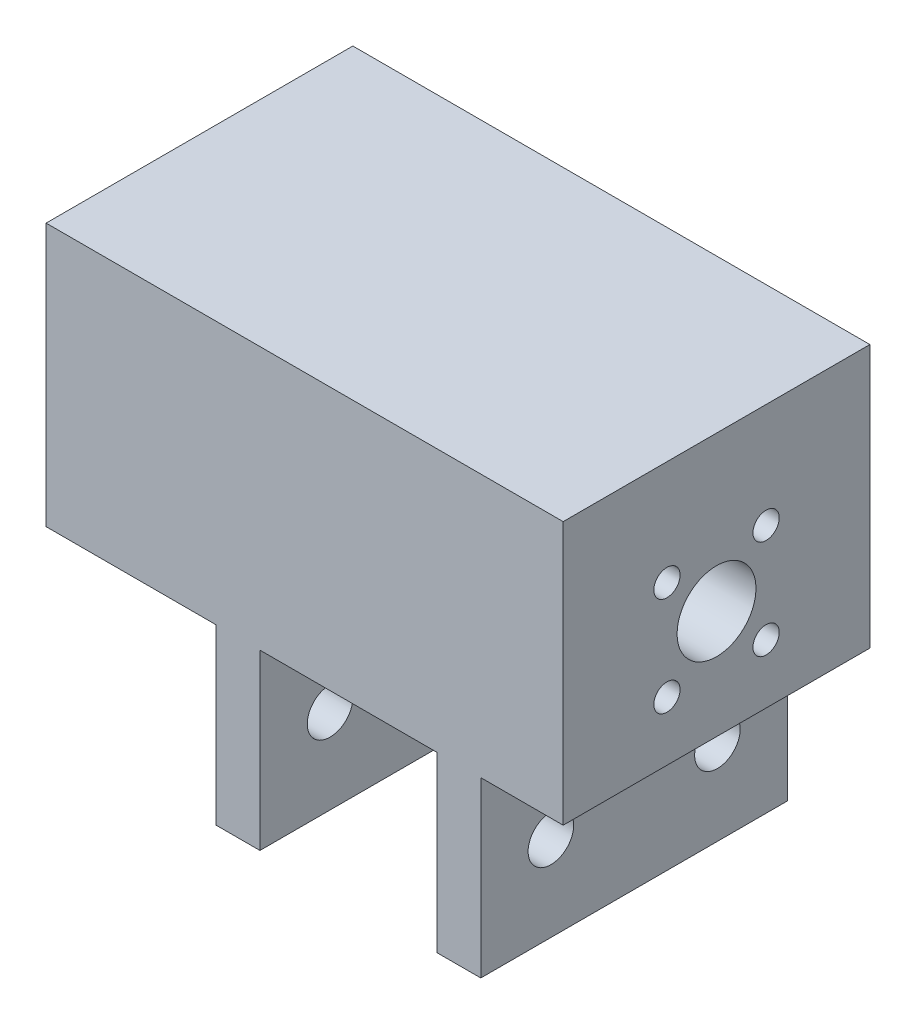
ISO-10303-21;
HEADER;
FILE_DESCRIPTION(('STEP AP214'),'2;1');
FILE_NAME('part.step','',(''),(''),'','','');
FILE_SCHEMA(('AUTOMOTIVE_DESIGN { 1 0 10303 214 1 1 1 1 }'));
ENDSEC;
DATA;
#1=APPLICATION_CONTEXT('core data for automotive mechanical design processes');
#2=APPLICATION_PROTOCOL_DEFINITION('international standard','automotive_design',2000,#1);
#3=PRODUCT_CONTEXT('',#1,'mechanical');
#4=PRODUCT('Part','Part','',(#3));
#5=PRODUCT_RELATED_PRODUCT_CATEGORY('part','',(#4));
#6=PRODUCT_DEFINITION_FORMATION('','',#4);
#7=PRODUCT_DEFINITION_CONTEXT('part definition',#1,'design');
#8=PRODUCT_DEFINITION('design','',#6,#7);
#9=PRODUCT_DEFINITION_SHAPE('','',#8);
#10=(LENGTH_UNIT() NAMED_UNIT(*) SI_UNIT(.MILLI.,.METRE.));
#11=(NAMED_UNIT(*) PLANE_ANGLE_UNIT() SI_UNIT($,.RADIAN.));
#12=(NAMED_UNIT(*) SI_UNIT($,.STERADIAN.) SOLID_ANGLE_UNIT());
#13=UNCERTAINTY_MEASURE_WITH_UNIT(LENGTH_MEASURE(1.E-05),#10,'distance_accuracy_value','');
#14=(GEOMETRIC_REPRESENTATION_CONTEXT(3) GLOBAL_UNCERTAINTY_ASSIGNED_CONTEXT((#13)) GLOBAL_UNIT_ASSIGNED_CONTEXT((#10,
#11,#12)) REPRESENTATION_CONTEXT('',''));
#15=CARTESIAN_POINT('',(0.,0.,0.));
#16=DIRECTION('',(0.,0.,1.));
#17=DIRECTION('',(1.,0.,0.));
#18=AXIS2_PLACEMENT_3D('',#15,#16,#17);
#19=CARTESIAN_POINT('',(24.5,3.05685424949239,11.8431457505076));
#20=DIRECTION('',(-1.,0.,0.));
#21=DIRECTION('',(0.,0.,1.));
#22=AXIS2_PLACEMENT_3D('',#19,#20,#21);
#23=CYLINDRICAL_SURFACE('',#22,1.5);
#24=CARTESIAN_POINT('',(24.5,3.05685424949239,11.8431457505076));
#25=DIRECTION('',(-1.,0.,0.));
#26=DIRECTION('',(0.,0.,1.));
#27=AXIS2_PLACEMENT_3D('',#24,#25,#26);
#28=CIRCLE('',#27,1.5);
#29=CARTESIAN_POINT('',(24.5,3.05685424949239,13.3431457505076));
#30=VERTEX_POINT('',#29);
#31=EDGE_CURVE('E243',#30,#30,#28,.T.);
#32=ORIENTED_EDGE('',*,*,#31,.F.);
#33=EDGE_LOOP('',(#32));
#34=FACE_BOUND('',#33,.T.);
#35=CARTESIAN_POINT('',(-20.5,3.05685424949239,11.8431457505076));
#36=DIRECTION('',(-1.,0.,0.));
#37=DIRECTION('',(0.,0.,1.));
#38=AXIS2_PLACEMENT_3D('',#35,#36,#37);
#39=CIRCLE('',#38,1.5);
#40=CARTESIAN_POINT('',(-20.5,3.05685424949239,13.3431457505076));
#41=VERTEX_POINT('',#40);
#42=EDGE_CURVE('E235',#41,#41,#39,.F.);
#43=ORIENTED_EDGE('',*,*,#42,.F.);
#44=EDGE_LOOP('',(#43));
#45=FACE_BOUND('',#44,.T.);
#46=ADVANCED_FACE('F41',(#34,#45),#23,.F.);
#47=CARTESIAN_POINT('',(24.5,3.05685424949239,23.1568542494924));
#48=DIRECTION('',(-1.,0.,0.));
#49=DIRECTION('',(0.,0.,1.));
#50=AXIS2_PLACEMENT_3D('',#47,#48,#49);
#51=CYLINDRICAL_SURFACE('',#50,1.5);
#52=CARTESIAN_POINT('',(24.5,3.05685424949239,23.1568542494924));
#53=DIRECTION('',(-1.,0.,0.));
#54=DIRECTION('',(0.,0.,1.));
#55=AXIS2_PLACEMENT_3D('',#52,#53,#54);
#56=CIRCLE('',#55,1.5);
#57=CARTESIAN_POINT('',(24.5,3.05685424949239,24.6568542494924));
#58=VERTEX_POINT('',#57);
#59=EDGE_CURVE('E240',#58,#58,#56,.T.);
#60=ORIENTED_EDGE('',*,*,#59,.F.);
#61=EDGE_LOOP('',(#60));
#62=FACE_BOUND('',#61,.T.);
#63=CARTESIAN_POINT('',(-20.5,3.05685424949239,23.1568542494924));
#64=DIRECTION('',(-1.,0.,0.));
#65=DIRECTION('',(0.,0.,1.));
#66=AXIS2_PLACEMENT_3D('',#63,#64,#65);
#67=CIRCLE('',#66,1.5);
#68=CARTESIAN_POINT('',(-20.5,3.05685424949239,24.6568542494924));
#69=VERTEX_POINT('',#68);
#70=EDGE_CURVE('E232',#69,#69,#67,.F.);
#71=ORIENTED_EDGE('',*,*,#70,.F.);
#72=EDGE_LOOP('',(#71));
#73=FACE_BOUND('',#72,.T.);
#74=ADVANCED_FACE('F339',(#62,#73),#51,.F.);
#75=CARTESIAN_POINT('',(24.5,-8.25685424949237,23.1568542494924));
#76=DIRECTION('',(-1.,0.,0.));
#77=DIRECTION('',(0.,0.,1.));
#78=AXIS2_PLACEMENT_3D('',#75,#76,#77);
#79=CYLINDRICAL_SURFACE('',#78,1.5);
#80=CARTESIAN_POINT('',(24.5,-8.25685424949237,23.1568542494924));
#81=DIRECTION('',(-1.,0.,0.));
#82=DIRECTION('',(0.,0.,1.));
#83=AXIS2_PLACEMENT_3D('',#80,#81,#82);
#84=CIRCLE('',#83,1.5);
#85=CARTESIAN_POINT('',(24.5,-8.25685424949237,24.6568542494924));
#86=VERTEX_POINT('',#85);
#87=EDGE_CURVE('E244',#86,#86,#84,.T.);
#88=ORIENTED_EDGE('',*,*,#87,.F.);
#89=EDGE_LOOP('',(#88));
#90=FACE_BOUND('',#89,.T.);
#91=CARTESIAN_POINT('',(-20.5,-8.25685424949237,23.1568542494924));
#92=DIRECTION('',(-1.,0.,0.));
#93=DIRECTION('',(0.,0.,1.));
#94=AXIS2_PLACEMENT_3D('',#91,#92,#93);
#95=CIRCLE('',#94,1.5);
#96=CARTESIAN_POINT('',(-20.5,-8.25685424949237,24.6568542494924));
#97=VERTEX_POINT('',#96);
#98=EDGE_CURVE('E229',#97,#97,#95,.F.);
#99=ORIENTED_EDGE('',*,*,#98,.F.);
#100=EDGE_LOOP('',(#99));
#101=FACE_BOUND('',#100,.T.);
#102=ADVANCED_FACE('F345',(#90,#101),#79,.F.);
#103=CARTESIAN_POINT('',(24.5,-8.25685424949237,11.8431457505076));
#104=DIRECTION('',(-1.,0.,0.));
#105=DIRECTION('',(0.,0.,1.));
#106=AXIS2_PLACEMENT_3D('',#103,#104,#105);
#107=CYLINDRICAL_SURFACE('',#106,1.5);
#108=CARTESIAN_POINT('',(24.5,-8.25685424949237,11.8431457505076));
#109=DIRECTION('',(-1.,0.,0.));
#110=DIRECTION('',(0.,0.,1.));
#111=AXIS2_PLACEMENT_3D('',#108,#109,#110);
#112=CIRCLE('',#111,1.5);
#113=CARTESIAN_POINT('',(24.5,-8.25685424949237,13.3431457505076));
#114=VERTEX_POINT('',#113);
#115=EDGE_CURVE('E198',#114,#114,#112,.T.);
#116=ORIENTED_EDGE('',*,*,#115,.F.);
#117=EDGE_LOOP('',(#116));
#118=FACE_BOUND('',#117,.T.);
#119=CARTESIAN_POINT('',(-20.5,-8.25685424949237,11.8431457505076));
#120=DIRECTION('',(-1.,0.,0.));
#121=DIRECTION('',(0.,0.,1.));
#122=AXIS2_PLACEMENT_3D('',#119,#120,#121);
#123=CIRCLE('',#122,1.5);
#124=CARTESIAN_POINT('',(-20.5,-8.25685424949237,13.3431457505076));
#125=VERTEX_POINT('',#124);
#126=EDGE_CURVE('E202',#125,#125,#123,.F.);
#127=ORIENTED_EDGE('',*,*,#126,.F.);
#128=EDGE_LOOP('',(#127));
#129=FACE_BOUND('',#128,.T.);
#130=ADVANCED_FACE('F352',(#118,#129),#107,.F.);
#131=CARTESIAN_POINT('',(-8.5,-2.59999999999999,17.5));
#132=DIRECTION('',(-1.,0.,0.));
#133=DIRECTION('',(0.,0.,1.));
#134=AXIS2_PLACEMENT_3D('',#131,#132,#133);
#135=CYLINDRICAL_SURFACE('',#134,5.2);
#136=CARTESIAN_POINT('',(-8.5,-2.59999999999999,17.5));
#137=DIRECTION('',(-1.,0.,0.));
#138=DIRECTION('',(0.,0.,1.));
#139=AXIS2_PLACEMENT_3D('',#136,#137,#138);
#140=CIRCLE('',#139,5.2);
#141=CARTESIAN_POINT('',(-8.5,-2.59999999999999,22.7));
#142=VERTEX_POINT('',#141);
#143=EDGE_CURVE('E199',#142,#142,#140,.T.);
#144=ORIENTED_EDGE('',*,*,#143,.F.);
#145=EDGE_LOOP('',(#144));
#146=FACE_BOUND('',#145,.T.);
#147=CARTESIAN_POINT('',(-20.5,-2.59999999999999,17.5));
#148=DIRECTION('',(-1.,0.,0.));
#149=DIRECTION('',(0.,0.,1.));
#150=AXIS2_PLACEMENT_3D('',#147,#148,#149);
#151=CIRCLE('',#150,5.2);
#152=CARTESIAN_POINT('',(-20.5,-2.59999999999999,22.7));
#153=VERTEX_POINT('',#152);
#154=EDGE_CURVE('E200',#153,#153,#151,.F.);
#155=ORIENTED_EDGE('',*,*,#154,.F.);
#156=EDGE_LOOP('',(#155));
#157=FACE_BOUND('',#156,.T.);
#158=ADVANCED_FACE('F357',(#146,#157),#135,.F.);
#159=CARTESIAN_POINT('',(-24.5,-2.59999999999999,17.5));
#160=DIRECTION('',(-1.,0.,0.));
#161=DIRECTION('',(0.,0.,1.));
#162=AXIS2_PLACEMENT_3D('',#159,#160,#161);
#163=CYLINDRICAL_SURFACE('',#162,4.50000000000001);
#164=CARTESIAN_POINT('',(24.5,-2.59999999999999,17.5));
#165=DIRECTION('',(-1.,0.,0.));
#166=DIRECTION('',(0.,0.,1.));
#167=AXIS2_PLACEMENT_3D('',#164,#165,#166);
#168=CIRCLE('',#167,4.50000000000001);
#169=CARTESIAN_POINT('',(24.5,-2.59999999999999,22.));
#170=VERTEX_POINT('',#169);
#171=EDGE_CURVE('E157',#170,#170,#168,.T.);
#172=ORIENTED_EDGE('',*,*,#171,.F.);
#173=EDGE_LOOP('',(#172));
#174=FACE_BOUND('',#173,.T.);
#175=CARTESIAN_POINT('',(-8.5,-2.59999999999999,17.5));
#176=DIRECTION('',(-1.,0.,0.));
#177=DIRECTION('',(0.,0.,1.));
#178=AXIS2_PLACEMENT_3D('',#175,#176,#177);
#179=CIRCLE('',#178,4.50000000000001);
#180=CARTESIAN_POINT('',(-8.5,-2.59999999999999,22.));
#181=VERTEX_POINT('',#180);
#182=EDGE_CURVE('E195',#181,#181,#179,.F.);
#183=ORIENTED_EDGE('',*,*,#182,.F.);
#184=EDGE_LOOP('',(#183));
#185=FACE_BOUND('',#184,.T.);
#186=ADVANCED_FACE('F354',(#174,#185),#163,.F.);
#187=CARTESIAN_POINT('',(15.1,0.,35.));
#188=DIRECTION('',(1.,0.,0.));
#189=DIRECTION('',(0.,1.,0.));
#190=AXIS2_PLACEMENT_3D('',#187,#188,#189);
#191=PLANE('',#190);
#192=CARTESIAN_POINT('',(15.1,-25.,8.));
#193=DIRECTION('',(1.,0.,0.));
#194=DIRECTION('',(0.,1.,0.));
#195=AXIS2_PLACEMENT_3D('',#192,#193,#194);
#196=CIRCLE('',#195,2.60000000000001);
#197=CARTESIAN_POINT('',(15.1,-22.4,8.));
#198=VERTEX_POINT('',#197);
#199=EDGE_CURVE('E214',#198,#198,#196,.T.);
#200=ORIENTED_EDGE('',*,*,#199,.F.);
#201=EDGE_LOOP('',(#200));
#202=FACE_BOUND('',#201,.T.);
#203=CARTESIAN_POINT('',(15.1,-25.,27.));
#204=DIRECTION('',(1.,0.,0.));
#205=DIRECTION('',(0.,1.,0.));
#206=AXIS2_PLACEMENT_3D('',#203,#204,#205);
#207=CIRCLE('',#206,2.60000000000001);
#208=CARTESIAN_POINT('',(15.1,-22.4,27.));
#209=VERTEX_POINT('',#208);
#210=EDGE_CURVE('E211',#209,#209,#207,.T.);
#211=ORIENTED_EDGE('',*,*,#210,.F.);
#212=EDGE_LOOP('',(#211));
#213=FACE_BOUND('',#212,.T.);
#214=DIRECTION('',(0.,-1.,0.));
#215=VECTOR('',#214,1.);
#216=CARTESIAN_POINT('',(15.1,0.,0.));
#217=LINE('',#216,#215);
#218=CARTESIAN_POINT('',(15.1,-15.,0.));
#219=VERTEX_POINT('',#218);
#220=CARTESIAN_POINT('',(15.1,-34.8,0.));
#221=VERTEX_POINT('',#220);
#222=EDGE_CURVE('E153',#219,#221,#217,.T.);
#223=ORIENTED_EDGE('',*,*,#222,.F.);
#224=DIRECTION('',(0.,0.,-1.));
#225=VECTOR('',#224,1.);
#226=CARTESIAN_POINT('',(15.1,-15.,35.));
#227=LINE('',#226,#225);
#228=CARTESIAN_POINT('',(15.1,-15.,35.));
#229=VERTEX_POINT('',#228);
#230=EDGE_CURVE('E11',#229,#219,#227,.T.);
#231=ORIENTED_EDGE('',*,*,#230,.F.);
#232=DIRECTION('',(0.,-1.,0.));
#233=VECTOR('',#232,1.);
#234=CARTESIAN_POINT('',(15.1,0.,35.));
#235=LINE('',#234,#233);
#236=CARTESIAN_POINT('',(15.1,-34.8,35.));
#237=VERTEX_POINT('',#236);
#238=EDGE_CURVE('E178',#229,#237,#235,.T.);
#239=ORIENTED_EDGE('',*,*,#238,.T.);
#240=DIRECTION('',(0.,0.,-1.));
#241=VECTOR('',#240,1.);
#242=CARTESIAN_POINT('',(15.1,-34.8,35.));
#243=LINE('',#242,#241);
#244=EDGE_CURVE('E101',#237,#221,#243,.T.);
#245=ORIENTED_EDGE('',*,*,#244,.T.);
#246=EDGE_LOOP('',(#223,#231,#239,#245));
#247=FACE_BOUND('',#246,.T.);
#248=ADVANCED_FACE('F43',(#202,#213,#247),#191,.T.);
#249=CARTESIAN_POINT('',(0.,-15.,35.));
#250=DIRECTION('',(0.,1.,0.));
#251=DIRECTION('',(0.,0.,1.));
#252=AXIS2_PLACEMENT_3D('',#249,#250,#251);
#253=PLANE('',#252);
#254=DIRECTION('',(1.,0.,0.));
#255=VECTOR('',#254,1.);
#256=CARTESIAN_POINT('',(0.,-15.,0.));
#257=LINE('',#256,#255);
#258=CARTESIAN_POINT('',(24.5,-15.,0.));
#259=VERTEX_POINT('',#258);
#260=EDGE_CURVE('E156',#219,#259,#257,.T.);
#261=ORIENTED_EDGE('',*,*,#260,.T.);
#262=DIRECTION('',(0.,0.,-1.));
#263=VECTOR('',#262,1.);
#264=CARTESIAN_POINT('',(24.5,-15.,35.));
#265=LINE('',#264,#263);
#266=CARTESIAN_POINT('',(24.5,-15.,35.));
#267=VERTEX_POINT('',#266);
#268=EDGE_CURVE('E51',#267,#259,#265,.T.);
#269=ORIENTED_EDGE('',*,*,#268,.F.);
#270=DIRECTION('',(1.,0.,0.));
#271=VECTOR('',#270,1.);
#272=CARTESIAN_POINT('',(0.,-15.,35.));
#273=LINE('',#272,#271);
#274=EDGE_CURVE('E254',#229,#267,#273,.T.);
#275=ORIENTED_EDGE('',*,*,#274,.F.);
#276=ORIENTED_EDGE('',*,*,#230,.T.);
#277=EDGE_LOOP('',(#261,#269,#275,#276));
#278=FACE_BOUND('',#277,.T.);
#279=ADVANCED_FACE('F285',(#278),#253,.F.);
#280=CARTESIAN_POINT('',(24.5,0.,35.));
#281=DIRECTION('',(-1.,0.,0.));
#282=DIRECTION('',(0.,0.,1.));
#283=AXIS2_PLACEMENT_3D('',#280,#281,#282);
#284=PLANE('',#283);
#285=ORIENTED_EDGE('',*,*,#115,.T.);
#286=EDGE_LOOP('',(#285));
#287=FACE_BOUND('',#286,.T.);
#288=ORIENTED_EDGE('',*,*,#87,.T.);
#289=EDGE_LOOP('',(#288));
#290=FACE_BOUND('',#289,.T.);
#291=ORIENTED_EDGE('',*,*,#59,.T.);
#292=EDGE_LOOP('',(#291));
#293=FACE_BOUND('',#292,.T.);
#294=ORIENTED_EDGE('',*,*,#31,.T.);
#295=EDGE_LOOP('',(#294));
#296=FACE_BOUND('',#295,.T.);
#297=ORIENTED_EDGE('',*,*,#171,.T.);
#298=EDGE_LOOP('',(#297));
#299=FACE_BOUND('',#298,.T.);
#300=DIRECTION('',(0.,1.,0.));
#301=VECTOR('',#300,1.);
#302=CARTESIAN_POINT('',(24.5,0.,0.));
#303=LINE('',#302,#301);
#304=CARTESIAN_POINT('',(24.5,15.,0.));
#305=VERTEX_POINT('',#304);
#306=EDGE_CURVE('E159',#259,#305,#303,.T.);
#307=ORIENTED_EDGE('',*,*,#306,.T.);
#308=DIRECTION('',(0.,0.,-1.));
#309=VECTOR('',#308,1.);
#310=CARTESIAN_POINT('',(24.5,15.,35.));
#311=LINE('',#310,#309);
#312=CARTESIAN_POINT('',(24.5,15.,35.));
#313=VERTEX_POINT('',#312);
#314=EDGE_CURVE('E191',#313,#305,#311,.T.);
#315=ORIENTED_EDGE('',*,*,#314,.F.);
#316=DIRECTION('',(0.,1.,0.));
#317=VECTOR('',#316,1.);
#318=CARTESIAN_POINT('',(24.5,0.,35.));
#319=LINE('',#318,#317);
#320=EDGE_CURVE('E256',#267,#313,#319,.T.);
#321=ORIENTED_EDGE('',*,*,#320,.F.);
#322=ORIENTED_EDGE('',*,*,#268,.T.);
#323=EDGE_LOOP('',(#307,#315,#321,#322));
#324=FACE_BOUND('',#323,.T.);
#325=ADVANCED_FACE('F288',(#287,#290,#293,#296,#299,#324),#284,.F.);
#326=CARTESIAN_POINT('',(0.,15.,35.));
#327=DIRECTION('',(0.,1.,0.));
#328=DIRECTION('',(0.,0.,1.));
#329=AXIS2_PLACEMENT_3D('',#326,#327,#328);
#330=PLANE('',#329);
#331=DIRECTION('',(1.,0.,0.));
#332=VECTOR('',#331,1.);
#333=CARTESIAN_POINT('',(0.,15.,0.));
#334=LINE('',#333,#332);
#335=CARTESIAN_POINT('',(-34.5,15.,0.));
#336=VERTEX_POINT('',#335);
#337=EDGE_CURVE('E162',#336,#305,#334,.T.);
#338=ORIENTED_EDGE('',*,*,#337,.F.);
#339=DIRECTION('',(0.,0.,-1.));
#340=VECTOR('',#339,1.);
#341=CARTESIAN_POINT('',(-34.5,15.,0.));
#342=LINE('',#341,#340);
#343=CARTESIAN_POINT('',(-34.5,15.,35.));
#344=VERTEX_POINT('',#343);
#345=EDGE_CURVE('E295',#344,#336,#342,.T.);
#346=ORIENTED_EDGE('',*,*,#345,.F.);
#347=DIRECTION('',(1.,0.,0.));
#348=VECTOR('',#347,1.);
#349=CARTESIAN_POINT('',(0.,15.,35.));
#350=LINE('',#349,#348);
#351=EDGE_CURVE('E258',#344,#313,#350,.T.);
#352=ORIENTED_EDGE('',*,*,#351,.T.);
#353=ORIENTED_EDGE('',*,*,#314,.T.);
#354=EDGE_LOOP('',(#338,#346,#352,#353));
#355=FACE_BOUND('',#354,.T.);
#356=ADVANCED_FACE('F292',(#355),#330,.T.);
#357=CARTESIAN_POINT('',(0.,-15.,35.));
#358=DIRECTION('',(0.,1.,0.));
#359=DIRECTION('',(0.,0.,1.));
#360=AXIS2_PLACEMENT_3D('',#357,#358,#359);
#361=PLANE('',#360);
#362=DIRECTION('',(1.,0.,0.));
#363=VECTOR('',#362,1.);
#364=CARTESIAN_POINT('',(0.,-15.,0.));
#365=LINE('',#364,#363);
#366=CARTESIAN_POINT('',(-34.5,-15.,0.));
#367=VERTEX_POINT('',#366);
#368=CARTESIAN_POINT('',(-15.1,-15.,0.));
#369=VERTEX_POINT('',#368);
#370=EDGE_CURVE('E165',#367,#369,#365,.T.);
#371=ORIENTED_EDGE('',*,*,#370,.T.);
#372=DIRECTION('',(0.,0.,-1.));
#373=VECTOR('',#372,1.);
#374=CARTESIAN_POINT('',(-15.1,-15.,35.));
#375=LINE('',#374,#373);
#376=CARTESIAN_POINT('',(-15.1,-15.,35.));
#377=VERTEX_POINT('',#376);
#378=EDGE_CURVE('E188',#377,#369,#375,.T.);
#379=ORIENTED_EDGE('',*,*,#378,.F.);
#380=DIRECTION('',(1.,0.,0.));
#381=VECTOR('',#380,1.);
#382=CARTESIAN_POINT('',(0.,-15.,35.));
#383=LINE('',#382,#381);
#384=CARTESIAN_POINT('',(-34.5,-15.,35.));
#385=VERTEX_POINT('',#384);
#386=EDGE_CURVE('E261',#385,#377,#383,.T.);
#387=ORIENTED_EDGE('',*,*,#386,.F.);
#388=DIRECTION('',(0.,0.,1.));
#389=VECTOR('',#388,1.);
#390=CARTESIAN_POINT('',(-34.5,-15.,0.));
#391=LINE('',#390,#389);
#392=EDGE_CURVE('E307',#367,#385,#391,.T.);
#393=ORIENTED_EDGE('',*,*,#392,.F.);
#394=EDGE_LOOP('',(#371,#379,#387,#393));
#395=FACE_BOUND('',#394,.T.);
#396=ADVANCED_FACE('F378',(#395),#361,.F.);
#397=CARTESIAN_POINT('',(-15.1,0.,35.));
#398=DIRECTION('',(1.,0.,0.));
#399=DIRECTION('',(0.,1.,0.));
#400=AXIS2_PLACEMENT_3D('',#397,#398,#399);
#401=PLANE('',#400);
#402=CARTESIAN_POINT('',(-15.1,-25.,8.));
#403=DIRECTION('',(-1.,0.,0.));
#404=DIRECTION('',(0.,0.,1.));
#405=AXIS2_PLACEMENT_3D('',#402,#403,#404);
#406=CIRCLE('',#405,2.60000000000001);
#407=CARTESIAN_POINT('',(-15.1,-25.,10.6));
#408=VERTEX_POINT('',#407);
#409=EDGE_CURVE('E309',#408,#408,#406,.T.);
#410=ORIENTED_EDGE('',*,*,#409,.F.);
#411=EDGE_LOOP('',(#410));
#412=FACE_BOUND('',#411,.T.);
#413=CARTESIAN_POINT('',(-15.1,-25.,27.));
#414=DIRECTION('',(-1.,0.,0.));
#415=DIRECTION('',(0.,0.,1.));
#416=AXIS2_PLACEMENT_3D('',#413,#414,#415);
#417=CIRCLE('',#416,2.60000000000001);
#418=CARTESIAN_POINT('',(-15.1,-25.,29.6));
#419=VERTEX_POINT('',#418);
#420=EDGE_CURVE('E207',#419,#419,#417,.T.);
#421=ORIENTED_EDGE('',*,*,#420,.F.);
#422=EDGE_LOOP('',(#421));
#423=FACE_BOUND('',#422,.T.);
#424=DIRECTION('',(0.,-1.,0.));
#425=VECTOR('',#424,1.);
#426=CARTESIAN_POINT('',(-15.1,0.,0.));
#427=LINE('',#426,#425);
#428=CARTESIAN_POINT('',(-15.1,-34.8,0.));
#429=VERTEX_POINT('',#428);
#430=EDGE_CURVE('E167',#369,#429,#427,.T.);
#431=ORIENTED_EDGE('',*,*,#430,.T.);
#432=DIRECTION('',(0.,0.,-1.));
#433=VECTOR('',#432,1.);
#434=CARTESIAN_POINT('',(-15.1,-34.8,35.));
#435=LINE('',#434,#433);
#436=CARTESIAN_POINT('',(-15.1,-34.8,35.));
#437=VERTEX_POINT('',#436);
#438=EDGE_CURVE('E185',#437,#429,#435,.T.);
#439=ORIENTED_EDGE('',*,*,#438,.F.);
#440=DIRECTION('',(0.,-1.,0.));
#441=VECTOR('',#440,1.);
#442=CARTESIAN_POINT('',(-15.1,0.,35.));
#443=LINE('',#442,#441);
#444=EDGE_CURVE('E263',#377,#437,#443,.T.);
#445=ORIENTED_EDGE('',*,*,#444,.F.);
#446=ORIENTED_EDGE('',*,*,#378,.T.);
#447=EDGE_LOOP('',(#431,#439,#445,#446));
#448=FACE_BOUND('',#447,.T.);
#449=ADVANCED_FACE('F375',(#412,#423,#448),#401,.F.);
#450=CARTESIAN_POINT('',(0.,-34.8,35.));
#451=DIRECTION('',(0.,1.,0.));
#452=DIRECTION('',(0.,0.,1.));
#453=AXIS2_PLACEMENT_3D('',#450,#451,#452);
#454=PLANE('',#453);
#455=DIRECTION('',(1.,0.,0.));
#456=VECTOR('',#455,1.);
#457=CARTESIAN_POINT('',(0.,-34.8,0.));
#458=LINE('',#457,#456);
#459=CARTESIAN_POINT('',(-10.1,-34.8,0.));
#460=VERTEX_POINT('',#459);
#461=EDGE_CURVE('E169',#429,#460,#458,.T.);
#462=ORIENTED_EDGE('',*,*,#461,.T.);
#463=DIRECTION('',(0.,0.,-1.));
#464=VECTOR('',#463,1.);
#465=CARTESIAN_POINT('',(-10.1,-34.8,35.));
#466=LINE('',#465,#464);
#467=CARTESIAN_POINT('',(-10.1,-34.8,35.));
#468=VERTEX_POINT('',#467);
#469=EDGE_CURVE('E182',#468,#460,#466,.T.);
#470=ORIENTED_EDGE('',*,*,#469,.F.);
#471=DIRECTION('',(1.,0.,0.));
#472=VECTOR('',#471,1.);
#473=CARTESIAN_POINT('',(0.,-34.8,35.));
#474=LINE('',#473,#472);
#475=EDGE_CURVE('E265',#437,#468,#474,.T.);
#476=ORIENTED_EDGE('',*,*,#475,.F.);
#477=ORIENTED_EDGE('',*,*,#438,.T.);
#478=EDGE_LOOP('',(#462,#470,#476,#477));
#479=FACE_BOUND('',#478,.T.);
#480=ADVANCED_FACE('F271',(#479),#454,.F.);
#481=CARTESIAN_POINT('',(-10.1,0.,35.));
#482=DIRECTION('',(-1.,0.,0.));
#483=DIRECTION('',(0.,0.,1.));
#484=AXIS2_PLACEMENT_3D('',#481,#482,#483);
#485=PLANE('',#484);
#486=CARTESIAN_POINT('',(-10.1,-25.,8.));
#487=DIRECTION('',(-1.,0.,0.));
#488=DIRECTION('',(0.,0.,1.));
#489=AXIS2_PLACEMENT_3D('',#486,#487,#488);
#490=CIRCLE('',#489,2.60000000000001);
#491=CARTESIAN_POINT('',(-10.1,-25.,10.6));
#492=VERTEX_POINT('',#491);
#493=EDGE_CURVE('E45',#492,#492,#490,.T.);
#494=ORIENTED_EDGE('',*,*,#493,.T.);
#495=EDGE_LOOP('',(#494));
#496=FACE_BOUND('',#495,.T.);
#497=CARTESIAN_POINT('',(-10.1,-25.,27.));
#498=DIRECTION('',(-1.,0.,0.));
#499=DIRECTION('',(0.,0.,1.));
#500=AXIS2_PLACEMENT_3D('',#497,#498,#499);
#501=CIRCLE('',#500,2.60000000000001);
#502=CARTESIAN_POINT('',(-10.1,-25.,29.6));
#503=VERTEX_POINT('',#502);
#504=EDGE_CURVE('E206',#503,#503,#501,.T.);
#505=ORIENTED_EDGE('',*,*,#504,.T.);
#506=EDGE_LOOP('',(#505));
#507=FACE_BOUND('',#506,.T.);
#508=DIRECTION('',(0.,1.,0.));
#509=VECTOR('',#508,1.);
#510=CARTESIAN_POINT('',(-10.1,0.,0.));
#511=LINE('',#510,#509);
#512=CARTESIAN_POINT('',(-10.1,-15.,0.));
#513=VERTEX_POINT('',#512);
#514=EDGE_CURVE('E171',#460,#513,#511,.T.);
#515=ORIENTED_EDGE('',*,*,#514,.T.);
#516=DIRECTION('',(0.,0.,-1.));
#517=VECTOR('',#516,1.);
#518=CARTESIAN_POINT('',(-10.1,-15.,35.));
#519=LINE('',#518,#517);
#520=CARTESIAN_POINT('',(-10.1,-15.,35.));
#521=VERTEX_POINT('',#520);
#522=EDGE_CURVE('E146',#521,#513,#519,.T.);
#523=ORIENTED_EDGE('',*,*,#522,.F.);
#524=DIRECTION('',(0.,1.,0.));
#525=VECTOR('',#524,1.);
#526=CARTESIAN_POINT('',(-10.1,0.,35.));
#527=LINE('',#526,#525);
#528=EDGE_CURVE('E133',#468,#521,#527,.T.);
#529=ORIENTED_EDGE('',*,*,#528,.F.);
#530=ORIENTED_EDGE('',*,*,#469,.T.);
#531=EDGE_LOOP('',(#515,#523,#529,#530));
#532=FACE_BOUND('',#531,.T.);
#533=ADVANCED_FACE('F275',(#496,#507,#532),#485,.F.);
#534=CARTESIAN_POINT('',(0.,-15.,35.));
#535=DIRECTION('',(0.,1.,0.));
#536=DIRECTION('',(0.,0.,1.));
#537=AXIS2_PLACEMENT_3D('',#534,#535,#536);
#538=PLANE('',#537);
#539=DIRECTION('',(1.,0.,0.));
#540=VECTOR('',#539,1.);
#541=CARTESIAN_POINT('',(0.,-15.,0.));
#542=LINE('',#541,#540);
#543=CARTESIAN_POINT('',(10.1,-15.,0.));
#544=VERTEX_POINT('',#543);
#545=EDGE_CURVE('E142',#513,#544,#542,.T.);
#546=ORIENTED_EDGE('',*,*,#545,.T.);
#547=DIRECTION('',(0.,0.,-1.));
#548=VECTOR('',#547,1.);
#549=CARTESIAN_POINT('',(10.1,-15.,35.));
#550=LINE('',#549,#548);
#551=CARTESIAN_POINT('',(10.1,-15.,35.));
#552=VERTEX_POINT('',#551);
#553=EDGE_CURVE('E139',#552,#544,#550,.T.);
#554=ORIENTED_EDGE('',*,*,#553,.F.);
#555=DIRECTION('',(1.,0.,0.));
#556=VECTOR('',#555,1.);
#557=CARTESIAN_POINT('',(0.,-15.,35.));
#558=LINE('',#557,#556);
#559=EDGE_CURVE('E127',#521,#552,#558,.T.);
#560=ORIENTED_EDGE('',*,*,#559,.F.);
#561=ORIENTED_EDGE('',*,*,#522,.T.);
#562=EDGE_LOOP('',(#546,#554,#560,#561));
#563=FACE_BOUND('',#562,.T.);
#564=ADVANCED_FACE('F140',(#563),#538,.F.);
#565=CARTESIAN_POINT('',(10.1,0.,35.));
#566=DIRECTION('',(-1.,0.,0.));
#567=DIRECTION('',(0.,0.,1.));
#568=AXIS2_PLACEMENT_3D('',#565,#566,#567);
#569=PLANE('',#568);
#570=CARTESIAN_POINT('',(10.1,-25.,8.));
#571=DIRECTION('',(-1.,0.,0.));
#572=DIRECTION('',(0.,0.,1.));
#573=AXIS2_PLACEMENT_3D('',#570,#571,#572);
#574=CIRCLE('',#573,2.60000000000001);
#575=CARTESIAN_POINT('',(10.1,-25.,10.6));
#576=VERTEX_POINT('',#575);
#577=EDGE_CURVE('E219',#576,#576,#574,.T.);
#578=ORIENTED_EDGE('',*,*,#577,.F.);
#579=EDGE_LOOP('',(#578));
#580=FACE_BOUND('',#579,.T.);
#581=CARTESIAN_POINT('',(10.1,-25.,27.));
#582=DIRECTION('',(-1.,0.,0.));
#583=DIRECTION('',(0.,0.,1.));
#584=AXIS2_PLACEMENT_3D('',#581,#582,#583);
#585=CIRCLE('',#584,2.60000000000001);
#586=CARTESIAN_POINT('',(10.1,-25.,29.6));
#587=VERTEX_POINT('',#586);
#588=EDGE_CURVE('E204',#587,#587,#585,.T.);
#589=ORIENTED_EDGE('',*,*,#588,.F.);
#590=EDGE_LOOP('',(#589));
#591=FACE_BOUND('',#590,.T.);
#592=DIRECTION('',(0.,1.,0.));
#593=VECTOR('',#592,1.);
#594=CARTESIAN_POINT('',(10.1,0.,0.));
#595=LINE('',#594,#593);
#596=CARTESIAN_POINT('',(10.1,-34.8,0.));
#597=VERTEX_POINT('',#596);
#598=EDGE_CURVE('E174',#597,#544,#595,.T.);
#599=ORIENTED_EDGE('',*,*,#598,.F.);
#600=DIRECTION('',(0.,0.,-1.));
#601=VECTOR('',#600,1.);
#602=CARTESIAN_POINT('',(10.1,-34.8,35.));
#603=LINE('',#602,#601);
#604=CARTESIAN_POINT('',(10.1,-34.8,35.));
#605=VERTEX_POINT('',#604);
#606=EDGE_CURVE('E94',#605,#597,#603,.T.);
#607=ORIENTED_EDGE('',*,*,#606,.F.);
#608=DIRECTION('',(0.,1.,0.));
#609=VECTOR('',#608,1.);
#610=CARTESIAN_POINT('',(10.1,0.,35.));
#611=LINE('',#610,#609);
#612=EDGE_CURVE('E131',#605,#552,#611,.T.);
#613=ORIENTED_EDGE('',*,*,#612,.T.);
#614=ORIENTED_EDGE('',*,*,#553,.T.);
#615=EDGE_LOOP('',(#599,#607,#613,#614));
#616=FACE_BOUND('',#615,.T.);
#617=ADVANCED_FACE('F148',(#580,#591,#616),#569,.T.);
#618=CARTESIAN_POINT('',(0.,-34.8,35.));
#619=DIRECTION('',(0.,1.,0.));
#620=DIRECTION('',(0.,0.,1.));
#621=AXIS2_PLACEMENT_3D('',#618,#619,#620);
#622=PLANE('',#621);
#623=DIRECTION('',(1.,0.,0.));
#624=VECTOR('',#623,1.);
#625=CARTESIAN_POINT('',(0.,-34.8,0.));
#626=LINE('',#625,#624);
#627=EDGE_CURVE('E176',#597,#221,#626,.T.);
#628=ORIENTED_EDGE('',*,*,#627,.T.);
#629=ORIENTED_EDGE('',*,*,#244,.F.);
#630=DIRECTION('',(1.,0.,0.));
#631=VECTOR('',#630,1.);
#632=CARTESIAN_POINT('',(0.,-34.8,35.));
#633=LINE('',#632,#631);
#634=EDGE_CURVE('E60',#605,#237,#633,.T.);
#635=ORIENTED_EDGE('',*,*,#634,.F.);
#636=ORIENTED_EDGE('',*,*,#606,.T.);
#637=EDGE_LOOP('',(#628,#629,#635,#636));
#638=FACE_BOUND('',#637,.T.);
#639=ADVANCED_FACE('F279',(#638),#622,.F.);
#640=CARTESIAN_POINT('',(0.,0.,35.));
#641=DIRECTION('',(0.,0.,1.));
#642=DIRECTION('',(1.,0.,0.));
#643=AXIS2_PLACEMENT_3D('',#640,#641,#642);
#644=PLANE('',#643);
#645=ORIENTED_EDGE('',*,*,#238,.F.);
#646=ORIENTED_EDGE('',*,*,#274,.T.);
#647=ORIENTED_EDGE('',*,*,#320,.T.);
#648=ORIENTED_EDGE('',*,*,#351,.F.);
#649=DIRECTION('',(0.,1.,0.));
#650=VECTOR('',#649,1.);
#651=CARTESIAN_POINT('',(-34.5,15.,35.));
#652=LINE('',#651,#650);
#653=EDGE_CURVE('E299',#385,#344,#652,.T.);
#654=ORIENTED_EDGE('',*,*,#653,.F.);
#655=ORIENTED_EDGE('',*,*,#386,.T.);
#656=ORIENTED_EDGE('',*,*,#444,.T.);
#657=ORIENTED_EDGE('',*,*,#475,.T.);
#658=ORIENTED_EDGE('',*,*,#528,.T.);
#659=ORIENTED_EDGE('',*,*,#559,.T.);
#660=ORIENTED_EDGE('',*,*,#612,.F.);
#661=ORIENTED_EDGE('',*,*,#634,.T.);
#662=EDGE_LOOP('',(#645,#646,#647,#648,#654,#655,#656,#657,#658,#659,#660,#661));
#663=FACE_BOUND('',#662,.T.);
#664=ADVANCED_FACE('F129',(#663),#644,.T.);
#665=CARTESIAN_POINT('',(0.,0.,0.));
#666=DIRECTION('',(0.,0.,1.));
#667=DIRECTION('',(1.,0.,0.));
#668=AXIS2_PLACEMENT_3D('',#665,#666,#667);
#669=PLANE('',#668);
#670=ORIENTED_EDGE('',*,*,#222,.T.);
#671=ORIENTED_EDGE('',*,*,#627,.F.);
#672=ORIENTED_EDGE('',*,*,#598,.T.);
#673=ORIENTED_EDGE('',*,*,#545,.F.);
#674=ORIENTED_EDGE('',*,*,#514,.F.);
#675=ORIENTED_EDGE('',*,*,#461,.F.);
#676=ORIENTED_EDGE('',*,*,#430,.F.);
#677=ORIENTED_EDGE('',*,*,#370,.F.);
#678=DIRECTION('',(0.,-1.,0.));
#679=VECTOR('',#678,1.);
#680=CARTESIAN_POINT('',(-34.5,15.,0.));
#681=LINE('',#680,#679);
#682=EDGE_CURVE('E311',#336,#367,#681,.T.);
#683=ORIENTED_EDGE('',*,*,#682,.F.);
#684=ORIENTED_EDGE('',*,*,#337,.T.);
#685=ORIENTED_EDGE('',*,*,#306,.F.);
#686=ORIENTED_EDGE('',*,*,#260,.F.);
#687=EDGE_LOOP('',(#670,#671,#672,#673,#674,#675,#676,#677,#683,#684,#685,#686));
#688=FACE_BOUND('',#687,.T.);
#689=ADVANCED_FACE('F277',(#688),#669,.F.);
#690=CARTESIAN_POINT('',(-8.5,-2.59999999999999,17.5));
#691=DIRECTION('',(-1.,0.,0.));
#692=DIRECTION('',(0.,0.,1.));
#693=AXIS2_PLACEMENT_3D('',#690,#691,#692);
#694=PLANE('',#693);
#695=ORIENTED_EDGE('',*,*,#143,.T.);
#696=EDGE_LOOP('',(#695));
#697=FACE_BOUND('',#696,.T.);
#698=ORIENTED_EDGE('',*,*,#182,.T.);
#699=EDGE_LOOP('',(#698));
#700=FACE_BOUND('',#699,.T.);
#701=ADVANCED_FACE('F363',(#697,#700),#694,.T.);
#702=CARTESIAN_POINT('',(-20.5,-2.59999999999999,17.5));
#703=DIRECTION('',(-1.,0.,0.));
#704=DIRECTION('',(0.,0.,1.));
#705=AXIS2_PLACEMENT_3D('',#702,#703,#704);
#706=PLANE('',#705);
#707=CARTESIAN_POINT('',(-20.5,-2.59999999999999,17.5));
#708=DIRECTION('',(-1.,0.,0.));
#709=DIRECTION('',(0.,0.,1.));
#710=AXIS2_PLACEMENT_3D('',#707,#708,#709);
#711=CIRCLE('',#710,11.75);
#712=CARTESIAN_POINT('',(-20.5,-2.59999999999999,29.25));
#713=VERTEX_POINT('',#712);
#714=EDGE_CURVE('E203',#713,#713,#711,.T.);
#715=ORIENTED_EDGE('',*,*,#714,.T.);
#716=EDGE_LOOP('',(#715));
#717=FACE_BOUND('',#716,.T.);
#718=ORIENTED_EDGE('',*,*,#154,.T.);
#719=EDGE_LOOP('',(#718));
#720=FACE_BOUND('',#719,.T.);
#721=ORIENTED_EDGE('',*,*,#126,.T.);
#722=EDGE_LOOP('',(#721));
#723=FACE_BOUND('',#722,.T.);
#724=ORIENTED_EDGE('',*,*,#98,.T.);
#725=EDGE_LOOP('',(#724));
#726=FACE_BOUND('',#725,.T.);
#727=ORIENTED_EDGE('',*,*,#70,.T.);
#728=EDGE_LOOP('',(#727));
#729=FACE_BOUND('',#728,.T.);
#730=ORIENTED_EDGE('',*,*,#42,.T.);
#731=EDGE_LOOP('',(#730));
#732=FACE_BOUND('',#731,.T.);
#733=ADVANCED_FACE('F403',(#717,#720,#723,#726,#729,#732),#706,.T.);
#734=CARTESIAN_POINT('',(-20.5,-2.59999999999999,17.5));
#735=DIRECTION('',(-1.,0.,0.));
#736=DIRECTION('',(0.,0.,1.));
#737=AXIS2_PLACEMENT_3D('',#734,#735,#736);
#738=CYLINDRICAL_SURFACE('',#737,11.75);
#739=ORIENTED_EDGE('',*,*,#714,.F.);
#740=EDGE_LOOP('',(#739));
#741=FACE_BOUND('',#740,.T.);
#742=CARTESIAN_POINT('',(-34.5,-2.59999999999999,17.5));
#743=DIRECTION('',(-1.,0.,0.));
#744=DIRECTION('',(0.,0.,1.));
#745=AXIS2_PLACEMENT_3D('',#742,#743,#744);
#746=CIRCLE('',#745,11.75);
#747=CARTESIAN_POINT('',(-34.5,-2.59999999999999,29.25));
#748=VERTEX_POINT('',#747);
#749=EDGE_CURVE('E677',#748,#748,#746,.T.);
#750=ORIENTED_EDGE('',*,*,#749,.T.);
#751=EDGE_LOOP('',(#750));
#752=FACE_BOUND('',#751,.T.);
#753=ADVANCED_FACE('F399',(#741,#752),#738,.F.);
#754=CARTESIAN_POINT('',(-15.1,-25.,27.));
#755=DIRECTION('',(-1.,0.,0.));
#756=DIRECTION('',(0.,0.,1.));
#757=AXIS2_PLACEMENT_3D('',#754,#755,#756);
#758=CYLINDRICAL_SURFACE('',#757,2.60000000000001);
#759=ORIENTED_EDGE('',*,*,#210,.T.);
#760=EDGE_LOOP('',(#759));
#761=FACE_BOUND('',#760,.T.);
#762=ORIENTED_EDGE('',*,*,#588,.T.);
#763=EDGE_LOOP('',(#762));
#764=FACE_BOUND('',#763,.T.);
#765=ADVANCED_FACE('F335',(#761,#764),#758,.F.);
#766=ORIENTED_EDGE('',*,*,#420,.T.);
#767=EDGE_LOOP('',(#766));
#768=FACE_BOUND('',#767,.T.);
#769=ORIENTED_EDGE('',*,*,#504,.F.);
#770=EDGE_LOOP('',(#769));
#771=FACE_BOUND('',#770,.T.);
#772=ADVANCED_FACE('F327',(#768,#771),#758,.F.);
#773=CARTESIAN_POINT('',(-15.1,-25.,8.));
#774=DIRECTION('',(-1.,0.,0.));
#775=DIRECTION('',(0.,0.,1.));
#776=AXIS2_PLACEMENT_3D('',#773,#774,#775);
#777=CYLINDRICAL_SURFACE('',#776,2.60000000000001);
#778=ORIENTED_EDGE('',*,*,#409,.T.);
#779=EDGE_LOOP('',(#778));
#780=FACE_BOUND('',#779,.T.);
#781=ORIENTED_EDGE('',*,*,#493,.F.);
#782=EDGE_LOOP('',(#781));
#783=FACE_BOUND('',#782,.T.);
#784=ADVANCED_FACE('F324',(#780,#783),#777,.F.);
#785=ORIENTED_EDGE('',*,*,#199,.T.);
#786=EDGE_LOOP('',(#785));
#787=FACE_BOUND('',#786,.T.);
#788=ORIENTED_EDGE('',*,*,#577,.T.);
#789=EDGE_LOOP('',(#788));
#790=FACE_BOUND('',#789,.T.);
#791=ADVANCED_FACE('F326',(#787,#790),#777,.F.);
#792=CARTESIAN_POINT('',(-34.5,0.,0.));
#793=DIRECTION('',(-1.,0.,0.));
#794=DIRECTION('',(0.,0.,1.));
#795=AXIS2_PLACEMENT_3D('',#792,#793,#794);
#796=PLANE('',#795);
#797=ORIENTED_EDGE('',*,*,#682,.T.);
#798=ORIENTED_EDGE('',*,*,#392,.T.);
#799=ORIENTED_EDGE('',*,*,#653,.T.);
#800=ORIENTED_EDGE('',*,*,#345,.T.);
#801=EDGE_LOOP('',(#797,#798,#799,#800));
#802=FACE_BOUND('',#801,.T.);
#803=ORIENTED_EDGE('',*,*,#749,.F.);
#804=EDGE_LOOP('',(#803));
#805=FACE_BOUND('',#804,.T.);
#806=ADVANCED_FACE('F303',(#802,#805),#796,.T.);
#807=CLOSED_SHELL('',(#46,#74,#102,#130,#158,#186,#248,#279,#325,#356,#396,#449,#480,#533,#564,
#617,#639,#664,#689,#701,#733,#753,#765,#772,#784,#791,#806));
#808=MANIFOLD_SOLID_BREP('B2',#807);
#809=ADVANCED_BREP_SHAPE_REPRESENTATION('',(#18,#808),#14);
#810=SHAPE_DEFINITION_REPRESENTATION(#9,#809);
ENDSEC;
END-ISO-10303-21;
